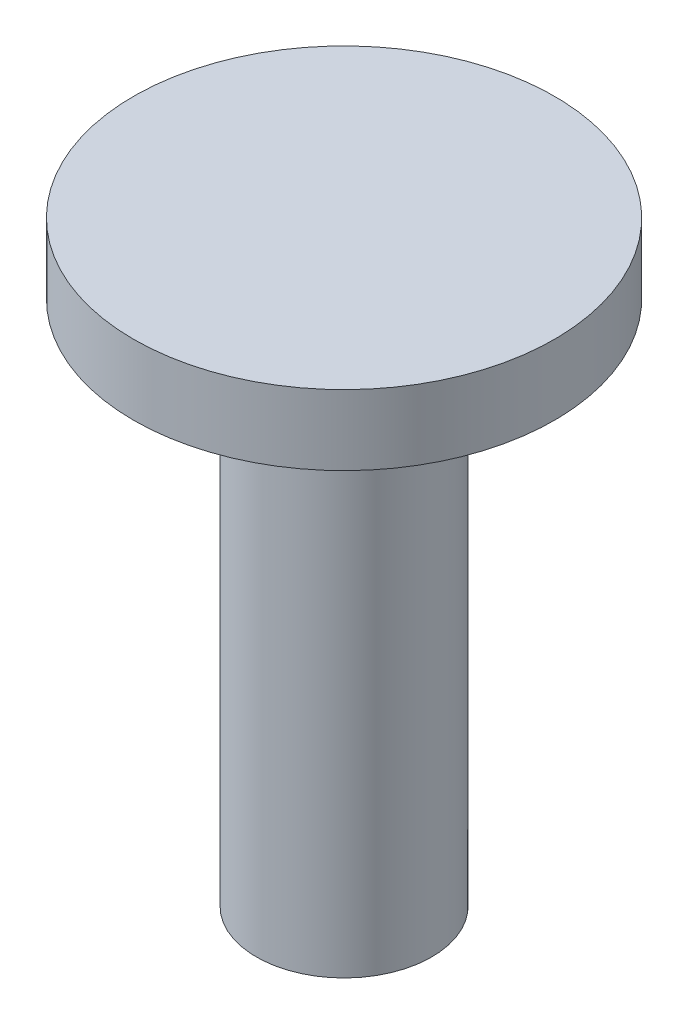
ISO-10303-21;
HEADER;
FILE_DESCRIPTION(('STEP AP214'),'2;1');
FILE_NAME('part.step','',(''),(''),'','','');
FILE_SCHEMA(('AUTOMOTIVE_DESIGN { 1 0 10303 214 1 1 1 1 }'));
ENDSEC;
DATA;
#1=APPLICATION_CONTEXT('core data for automotive mechanical design processes');
#2=APPLICATION_PROTOCOL_DEFINITION('international standard','automotive_design',2000,#1);
#3=PRODUCT_CONTEXT('',#1,'mechanical');
#4=PRODUCT('Part','Part','',(#3));
#5=PRODUCT_RELATED_PRODUCT_CATEGORY('part','',(#4));
#6=PRODUCT_DEFINITION_FORMATION('','',#4);
#7=PRODUCT_DEFINITION_CONTEXT('part definition',#1,'design');
#8=PRODUCT_DEFINITION('design','',#6,#7);
#9=PRODUCT_DEFINITION_SHAPE('','',#8);
#10=(LENGTH_UNIT() NAMED_UNIT(*) SI_UNIT(.MILLI.,.METRE.));
#11=(NAMED_UNIT(*) PLANE_ANGLE_UNIT() SI_UNIT($,.RADIAN.));
#12=(NAMED_UNIT(*) SI_UNIT($,.STERADIAN.) SOLID_ANGLE_UNIT());
#13=UNCERTAINTY_MEASURE_WITH_UNIT(LENGTH_MEASURE(1.E-05),#10,'distance_accuracy_value','');
#14=(GEOMETRIC_REPRESENTATION_CONTEXT(3) GLOBAL_UNCERTAINTY_ASSIGNED_CONTEXT((#13)) GLOBAL_UNIT_ASSIGNED_CONTEXT((#10,
#11,#12)) REPRESENTATION_CONTEXT('',''));
#15=CARTESIAN_POINT('',(0.,0.,0.));
#16=DIRECTION('',(0.,0.,1.));
#17=DIRECTION('',(1.,0.,0.));
#18=AXIS2_PLACEMENT_3D('',#15,#16,#17);
#19=CARTESIAN_POINT('',(0.,0.8,0.));
#20=DIRECTION('',(0.,-1.,0.));
#21=DIRECTION('',(0.,0.,-1.));
#22=AXIS2_PLACEMENT_3D('',#19,#20,#21);
#23=CYLINDRICAL_SURFACE('',#22,2.4);
#24=CARTESIAN_POINT('',(0.,0.8,0.));
#25=DIRECTION('',(0.,1.,0.));
#26=DIRECTION('',(0.,0.,1.));
#27=AXIS2_PLACEMENT_3D('',#24,#25,#26);
#28=CIRCLE('',#27,2.4);
#29=CARTESIAN_POINT('',(0.,0.8,2.4));
#30=VERTEX_POINT('',#29);
#31=EDGE_CURVE('E46',#30,#30,#28,.T.);
#32=ORIENTED_EDGE('',*,*,#31,.F.);
#33=EDGE_LOOP('',(#32));
#34=FACE_BOUND('',#33,.T.);
#35=CARTESIAN_POINT('',(0.,0.,0.));
#36=DIRECTION('',(0.,1.,0.));
#37=DIRECTION('',(0.,0.,1.));
#38=AXIS2_PLACEMENT_3D('',#35,#36,#37);
#39=CIRCLE('',#38,2.4);
#40=CARTESIAN_POINT('',(0.,0.,2.4));
#41=VERTEX_POINT('',#40);
#42=EDGE_CURVE('E42',#41,#41,#39,.T.);
#43=ORIENTED_EDGE('',*,*,#42,.T.);
#44=EDGE_LOOP('',(#43));
#45=FACE_BOUND('',#44,.T.);
#46=ADVANCED_FACE('F39',(#34,#45),#23,.T.);
#47=CARTESIAN_POINT('',(0.,0.8,0.));
#48=DIRECTION('',(0.,1.,0.));
#49=DIRECTION('',(0.,0.,1.));
#50=AXIS2_PLACEMENT_3D('',#47,#48,#49);
#51=PLANE('',#50);
#52=ORIENTED_EDGE('',*,*,#31,.T.);
#53=EDGE_LOOP('',(#52));
#54=FACE_BOUND('',#53,.T.);
#55=ADVANCED_FACE('F63',(#54),#51,.T.);
#56=CARTESIAN_POINT('',(0.,0.,0.));
#57=DIRECTION('',(0.,1.,0.));
#58=DIRECTION('',(0.,0.,1.));
#59=AXIS2_PLACEMENT_3D('',#56,#57,#58);
#60=PLANE('',#59);
#61=CARTESIAN_POINT('',(0.,0.,0.));
#62=DIRECTION('',(0.,-1.,0.));
#63=DIRECTION('',(0.,0.,-1.));
#64=AXIS2_PLACEMENT_3D('',#61,#62,#63);
#65=CIRCLE('',#64,1.);
#66=CARTESIAN_POINT('',(0.,0.,-1.));
#67=VERTEX_POINT('',#66);
#68=EDGE_CURVE('E10',#67,#67,#65,.T.);
#69=ORIENTED_EDGE('',*,*,#68,.F.);
#70=EDGE_LOOP('',(#69));
#71=FACE_BOUND('',#70,.T.);
#72=ORIENTED_EDGE('',*,*,#42,.F.);
#73=EDGE_LOOP('',(#72));
#74=FACE_BOUND('',#73,.T.);
#75=ADVANCED_FACE('F60',(#71,#74),#60,.F.);
#76=CARTESIAN_POINT('',(0.,-6.,0.));
#77=DIRECTION('',(0.,1.,0.));
#78=DIRECTION('',(0.,0.,1.));
#79=AXIS2_PLACEMENT_3D('',#76,#77,#78);
#80=CYLINDRICAL_SURFACE('',#79,1.);
#81=CARTESIAN_POINT('',(0.,-6.,0.));
#82=DIRECTION('',(0.,-1.,0.));
#83=DIRECTION('',(0.,0.,-1.));
#84=AXIS2_PLACEMENT_3D('',#81,#82,#83);
#85=CIRCLE('',#84,1.);
#86=CARTESIAN_POINT('',(0.,-6.,-1.));
#87=VERTEX_POINT('',#86);
#88=EDGE_CURVE('E52',#87,#87,#85,.T.);
#89=ORIENTED_EDGE('',*,*,#88,.F.);
#90=EDGE_LOOP('',(#89));
#91=FACE_BOUND('',#90,.T.);
#92=ORIENTED_EDGE('',*,*,#68,.T.);
#93=EDGE_LOOP('',(#92));
#94=FACE_BOUND('',#93,.T.);
#95=ADVANCED_FACE('F62',(#91,#94),#80,.T.);
#96=CARTESIAN_POINT('',(0.,-6.,0.));
#97=DIRECTION('',(0.,-1.,0.));
#98=DIRECTION('',(0.,0.,-1.));
#99=AXIS2_PLACEMENT_3D('',#96,#97,#98);
#100=PLANE('',#99);
#101=ORIENTED_EDGE('',*,*,#88,.T.);
#102=EDGE_LOOP('',(#101));
#103=FACE_BOUND('',#102,.T.);
#104=ADVANCED_FACE('F69',(#103),#100,.T.);
#105=CLOSED_SHELL('',(#46,#55,#75,#95,#104));
#106=MANIFOLD_SOLID_BREP('B2',#105);
#107=ADVANCED_BREP_SHAPE_REPRESENTATION('',(#18,#106),#14);
#108=SHAPE_DEFINITION_REPRESENTATION(#9,#107);
ENDSEC;
END-ISO-10303-21;
